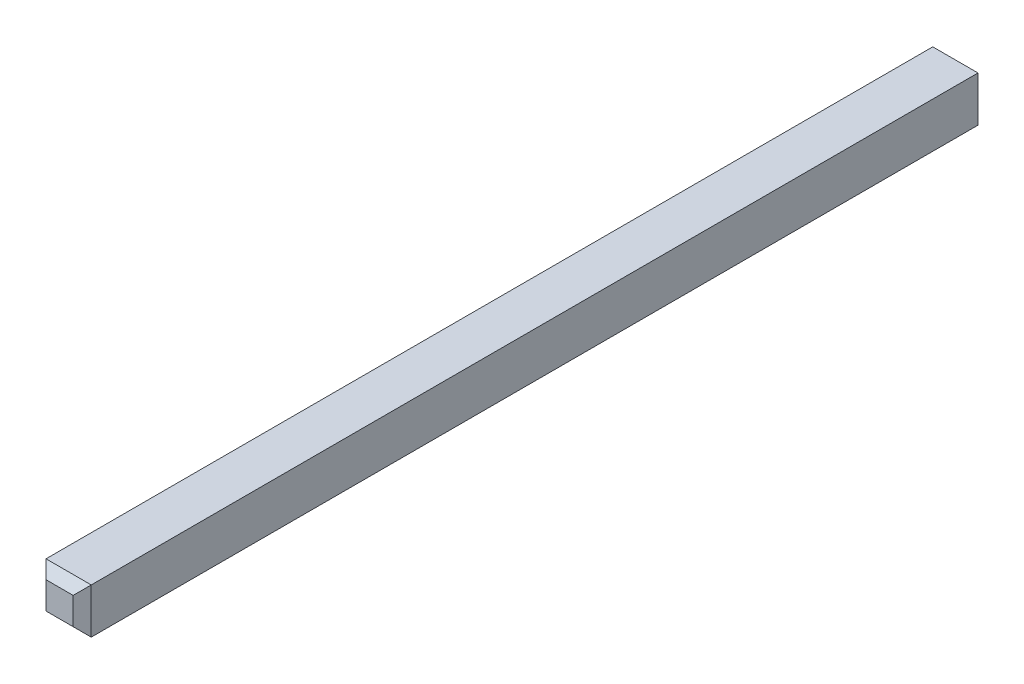
ISO-10303-21;
HEADER;
FILE_DESCRIPTION(('STEP AP214'),'2;1');
FILE_NAME('part.step','',(''),(''),'','','');
FILE_SCHEMA(('AUTOMOTIVE_DESIGN { 1 0 10303 214 1 1 1 1 }'));
ENDSEC;
DATA;
#1=APPLICATION_CONTEXT('core data for automotive mechanical design processes');
#2=APPLICATION_PROTOCOL_DEFINITION('international standard','automotive_design',2000,#1);
#3=PRODUCT_CONTEXT('',#1,'mechanical');
#4=PRODUCT('Part','Part','',(#3));
#5=PRODUCT_RELATED_PRODUCT_CATEGORY('part','',(#4));
#6=PRODUCT_DEFINITION_FORMATION('','',#4);
#7=PRODUCT_DEFINITION_CONTEXT('part definition',#1,'design');
#8=PRODUCT_DEFINITION('design','',#6,#7);
#9=PRODUCT_DEFINITION_SHAPE('','',#8);
#10=(LENGTH_UNIT() NAMED_UNIT(*) SI_UNIT(.MILLI.,.METRE.));
#11=(NAMED_UNIT(*) PLANE_ANGLE_UNIT() SI_UNIT($,.RADIAN.));
#12=(NAMED_UNIT(*) SI_UNIT($,.STERADIAN.) SOLID_ANGLE_UNIT());
#13=UNCERTAINTY_MEASURE_WITH_UNIT(LENGTH_MEASURE(1.E-05),#10,'distance_accuracy_value','');
#14=(GEOMETRIC_REPRESENTATION_CONTEXT(3) GLOBAL_UNCERTAINTY_ASSIGNED_CONTEXT((#13)) GLOBAL_UNIT_ASSIGNED_CONTEXT((#10,
#11,#12)) REPRESENTATION_CONTEXT('',''));
#15=CARTESIAN_POINT('',(0.,0.,0.));
#16=DIRECTION('',(0.,0.,1.));
#17=DIRECTION('',(1.,0.,0.));
#18=AXIS2_PLACEMENT_3D('',#15,#16,#17);
#19=CARTESIAN_POINT('',(0.249999999999999,0.25,10.));
#20=DIRECTION('',(-1.,0.,0.));
#21=DIRECTION('',(0.,-1.,0.));
#22=AXIS2_PLACEMENT_3D('',#19,#20,#21);
#23=PLANE('',#22);
#24=DIRECTION('',(0.,0.,-1.));
#25=VECTOR('',#24,1.);
#26=CARTESIAN_POINT('',(0.249999999999999,0.25,10.));
#27=LINE('',#26,#25);
#28=CARTESIAN_POINT('',(0.249999999999999,0.25,9.9));
#29=VERTEX_POINT('',#28);
#30=CARTESIAN_POINT('',(0.249999999999999,0.25,0.100000000000001));
#31=VERTEX_POINT('',#30);
#32=EDGE_CURVE('E119',#29,#31,#27,.T.);
#33=ORIENTED_EDGE('',*,*,#32,.F.);
#34=DIRECTION('',(0.,-1.,0.));
#35=VECTOR('',#34,1.);
#36=CARTESIAN_POINT('',(0.249999999999999,-0.25,9.9));
#37=LINE('',#36,#35);
#38=CARTESIAN_POINT('',(0.249999999999999,-0.25,9.9));
#39=VERTEX_POINT('',#38);
#40=EDGE_CURVE('E143',#29,#39,#37,.T.);
#41=ORIENTED_EDGE('',*,*,#40,.T.);
#42=DIRECTION('',(0.,0.,-1.));
#43=VECTOR('',#42,1.);
#44=CARTESIAN_POINT('',(0.249999999999999,-0.25,10.));
#45=LINE('',#44,#43);
#46=CARTESIAN_POINT('',(0.249999999999999,-0.25,0.100000000000001));
#47=VERTEX_POINT('',#46);
#48=EDGE_CURVE('E154',#39,#47,#45,.T.);
#49=ORIENTED_EDGE('',*,*,#48,.T.);
#50=DIRECTION('',(0.,1.,0.));
#51=VECTOR('',#50,1.);
#52=CARTESIAN_POINT('',(0.249999999999999,0.25,0.100000000000001));
#53=LINE('',#52,#51);
#54=EDGE_CURVE('E141',#47,#31,#53,.T.);
#55=ORIENTED_EDGE('',*,*,#54,.T.);
#56=EDGE_LOOP('',(#33,#41,#49,#55));
#57=FACE_BOUND('',#56,.T.);
#58=ADVANCED_FACE('F34',(#57),#23,.F.);
#59=CARTESIAN_POINT('',(-0.250000000000001,0.25,10.));
#60=DIRECTION('',(0.,-1.,0.));
#61=DIRECTION('',(0.,0.,-1.));
#62=AXIS2_PLACEMENT_3D('',#59,#60,#61);
#63=PLANE('',#62);
#64=DIRECTION('',(0.,0.,-1.));
#65=VECTOR('',#64,1.);
#66=CARTESIAN_POINT('',(-0.250000000000001,0.25,10.));
#67=LINE('',#66,#65);
#68=CARTESIAN_POINT('',(-0.250000000000001,0.25,9.9));
#69=VERTEX_POINT('',#68);
#70=CARTESIAN_POINT('',(-0.250000000000001,0.25,0.100000000000001));
#71=VERTEX_POINT('',#70);
#72=EDGE_CURVE('E281',#69,#71,#67,.T.);
#73=ORIENTED_EDGE('',*,*,#72,.F.);
#74=DIRECTION('',(1.,0.,0.));
#75=VECTOR('',#74,1.);
#76=CARTESIAN_POINT('',(0.249999999999999,0.25,9.9));
#77=LINE('',#76,#75);
#78=EDGE_CURVE('E139',#69,#29,#77,.T.);
#79=ORIENTED_EDGE('',*,*,#78,.T.);
#80=ORIENTED_EDGE('',*,*,#32,.T.);
#81=DIRECTION('',(-1.,0.,0.));
#82=VECTOR('',#81,1.);
#83=CARTESIAN_POINT('',(-0.250000000000001,0.25,0.100000000000001));
#84=LINE('',#83,#82);
#85=EDGE_CURVE('E136',#31,#71,#84,.T.);
#86=ORIENTED_EDGE('',*,*,#85,.T.);
#87=EDGE_LOOP('',(#73,#79,#80,#86));
#88=FACE_BOUND('',#87,.T.);
#89=ADVANCED_FACE('F191',(#88),#63,.F.);
#90=CARTESIAN_POINT('',(-0.250000000000001,0.25,10.));
#91=DIRECTION('',(1.,0.,0.));
#92=DIRECTION('',(0.,1.,0.));
#93=AXIS2_PLACEMENT_3D('',#90,#91,#92);
#94=PLANE('',#93);
#95=DIRECTION('',(0.,0.,-1.));
#96=VECTOR('',#95,1.);
#97=CARTESIAN_POINT('',(-0.250000000000001,-0.25,10.));
#98=LINE('',#97,#96);
#99=CARTESIAN_POINT('',(-0.250000000000001,-0.25,9.9));
#100=VERTEX_POINT('',#99);
#101=CARTESIAN_POINT('',(-0.250000000000001,-0.25,0.100000000000001));
#102=VERTEX_POINT('',#101);
#103=EDGE_CURVE('E277',#100,#102,#98,.T.);
#104=ORIENTED_EDGE('',*,*,#103,.F.);
#105=DIRECTION('',(0.,1.,0.));
#106=VECTOR('',#105,1.);
#107=CARTESIAN_POINT('',(-0.250000000000001,0.25,9.9));
#108=LINE('',#107,#106);
#109=EDGE_CURVE('E134',#100,#69,#108,.T.);
#110=ORIENTED_EDGE('',*,*,#109,.T.);
#111=ORIENTED_EDGE('',*,*,#72,.T.);
#112=DIRECTION('',(0.,-1.,0.));
#113=VECTOR('',#112,1.);
#114=CARTESIAN_POINT('',(-0.250000000000001,0.25,0.100000000000001));
#115=LINE('',#114,#113);
#116=EDGE_CURVE('E132',#71,#102,#115,.T.);
#117=ORIENTED_EDGE('',*,*,#116,.T.);
#118=EDGE_LOOP('',(#104,#110,#111,#117));
#119=FACE_BOUND('',#118,.T.);
#120=ADVANCED_FACE('F197',(#119),#94,.F.);
#121=CARTESIAN_POINT('',(-0.250000000000001,-0.25,10.));
#122=DIRECTION('',(0.,1.,0.));
#123=DIRECTION('',(0.,0.,1.));
#124=AXIS2_PLACEMENT_3D('',#121,#122,#123);
#125=PLANE('',#124);
#126=ORIENTED_EDGE('',*,*,#48,.F.);
#127=DIRECTION('',(-1.,0.,0.));
#128=VECTOR('',#127,1.);
#129=CARTESIAN_POINT('',(-0.250000000000001,-0.25,9.9));
#130=LINE('',#129,#128);
#131=EDGE_CURVE('E106',#39,#100,#130,.T.);
#132=ORIENTED_EDGE('',*,*,#131,.T.);
#133=ORIENTED_EDGE('',*,*,#103,.T.);
#134=DIRECTION('',(1.,0.,0.));
#135=VECTOR('',#134,1.);
#136=CARTESIAN_POINT('',(-0.250000000000001,-0.25,0.100000000000001));
#137=LINE('',#136,#135);
#138=EDGE_CURVE('E125',#102,#47,#137,.T.);
#139=ORIENTED_EDGE('',*,*,#138,.T.);
#140=EDGE_LOOP('',(#126,#132,#133,#139));
#141=FACE_BOUND('',#140,.T.);
#142=ADVANCED_FACE('F187',(#141),#125,.F.);
#143=CARTESIAN_POINT('',(0.,0.,10.));
#144=DIRECTION('',(0.,0.,1.));
#145=DIRECTION('',(1.,0.,0.));
#146=AXIS2_PLACEMENT_3D('',#143,#144,#145);
#147=PLANE('',#146);
#148=DIRECTION('',(0.,-1.,0.));
#149=VECTOR('',#148,1.);
#150=CARTESIAN_POINT('',(-0.150000000000003,-0.25,10.));
#151=LINE('',#150,#149);
#152=CARTESIAN_POINT('',(-0.150000000000003,0.150000000000002,10.));
#153=VERTEX_POINT('',#152);
#154=CARTESIAN_POINT('',(-0.150000000000003,-0.150000000000002,10.));
#155=VERTEX_POINT('',#154);
#156=EDGE_CURVE('E123',#153,#155,#151,.T.);
#157=ORIENTED_EDGE('',*,*,#156,.T.);
#158=DIRECTION('',(1.,0.,0.));
#159=VECTOR('',#158,1.);
#160=CARTESIAN_POINT('',(0.249999999999999,-0.150000000000002,10.));
#161=LINE('',#160,#159);
#162=CARTESIAN_POINT('',(0.15,-0.150000000000002,10.));
#163=VERTEX_POINT('',#162);
#164=EDGE_CURVE('E104',#155,#163,#161,.T.);
#165=ORIENTED_EDGE('',*,*,#164,.T.);
#166=DIRECTION('',(0.,1.,0.));
#167=VECTOR('',#166,1.);
#168=CARTESIAN_POINT('',(0.15,0.25,10.));
#169=LINE('',#168,#167);
#170=CARTESIAN_POINT('',(0.15,0.150000000000002,10.));
#171=VERTEX_POINT('',#170);
#172=EDGE_CURVE('E112',#163,#171,#169,.T.);
#173=ORIENTED_EDGE('',*,*,#172,.T.);
#174=DIRECTION('',(-1.,0.,0.));
#175=VECTOR('',#174,1.);
#176=CARTESIAN_POINT('',(-0.250000000000001,0.150000000000002,10.));
#177=LINE('',#176,#175);
#178=EDGE_CURVE('E118',#171,#153,#177,.T.);
#179=ORIENTED_EDGE('',*,*,#178,.T.);
#180=EDGE_LOOP('',(#157,#165,#173,#179));
#181=FACE_BOUND('',#180,.T.);
#182=ADVANCED_FACE('F121',(#181),#147,.T.);
#183=CARTESIAN_POINT('',(0.,0.,0.));
#184=DIRECTION('',(0.,0.,1.));
#185=DIRECTION('',(1.,0.,0.));
#186=AXIS2_PLACEMENT_3D('',#183,#184,#185);
#187=PLANE('',#186);
#188=DIRECTION('',(0.,1.,0.));
#189=VECTOR('',#188,1.);
#190=CARTESIAN_POINT('',(-0.15,0.,0.));
#191=LINE('',#190,#189);
#192=CARTESIAN_POINT('',(-0.15,-0.149999999999999,0.));
#193=VERTEX_POINT('',#192);
#194=CARTESIAN_POINT('',(-0.15,0.149999999999999,0.));
#195=VERTEX_POINT('',#194);
#196=EDGE_CURVE('E43',#193,#195,#191,.T.);
#197=ORIENTED_EDGE('',*,*,#196,.T.);
#198=DIRECTION('',(1.,0.,0.));
#199=VECTOR('',#198,1.);
#200=CARTESIAN_POINT('',(0.,0.149999999999999,0.));
#201=LINE('',#200,#199);
#202=CARTESIAN_POINT('',(0.149999999999998,0.149999999999999,0.));
#203=VERTEX_POINT('',#202);
#204=EDGE_CURVE('E11',#195,#203,#201,.T.);
#205=ORIENTED_EDGE('',*,*,#204,.T.);
#206=DIRECTION('',(0.,-1.,0.));
#207=VECTOR('',#206,1.);
#208=CARTESIAN_POINT('',(0.149999999999998,0.,0.));
#209=LINE('',#208,#207);
#210=CARTESIAN_POINT('',(0.149999999999998,-0.149999999999999,0.));
#211=VERTEX_POINT('',#210);
#212=EDGE_CURVE('E145',#203,#211,#209,.T.);
#213=ORIENTED_EDGE('',*,*,#212,.T.);
#214=DIRECTION('',(-1.,0.,0.));
#215=VECTOR('',#214,1.);
#216=CARTESIAN_POINT('',(0.,-0.149999999999999,0.));
#217=LINE('',#216,#215);
#218=EDGE_CURVE('E54',#211,#193,#217,.T.);
#219=ORIENTED_EDGE('',*,*,#218,.T.);
#220=EDGE_LOOP('',(#197,#205,#213,#219));
#221=FACE_BOUND('',#220,.T.);
#222=ADVANCED_FACE('F176',(#221),#187,.F.);
#223=CARTESIAN_POINT('',(0.,0.150000000000002,10.));
#224=DIRECTION('',(0.,0.707106781186551,0.707106781186544));
#225=DIRECTION('',(1.,0.,0.));
#226=AXIS2_PLACEMENT_3D('',#223,#224,#225);
#227=PLANE('',#226);
#228=DIRECTION('',(-0.577350269189624,-0.577350269189624,0.577350269189629));
#229=VECTOR('',#228,1.);
#230=CARTESIAN_POINT('',(0.1,0.100000000000001,10.05));
#231=LINE('',#230,#229);
#232=EDGE_CURVE('E115',#29,#171,#231,.T.);
#233=ORIENTED_EDGE('',*,*,#232,.F.);
#234=ORIENTED_EDGE('',*,*,#78,.F.);
#235=DIRECTION('',(0.577350269189624,-0.577350269189624,0.577350269189629));
#236=VECTOR('',#235,1.);
#237=CARTESIAN_POINT('',(-0.100000000000002,0.100000000000001,10.05));
#238=LINE('',#237,#236);
#239=EDGE_CURVE('E151',#153,#69,#238,.F.);
#240=ORIENTED_EDGE('',*,*,#239,.F.);
#241=ORIENTED_EDGE('',*,*,#178,.F.);
#242=EDGE_LOOP('',(#233,#234,#240,#241));
#243=FACE_BOUND('',#242,.T.);
#244=ADVANCED_FACE('F178',(#243),#227,.T.);
#245=CARTESIAN_POINT('',(-0.150000000000003,0.,10.));
#246=DIRECTION('',(-0.707106781186551,0.,0.707106781186544));
#247=DIRECTION('',(0.,1.,0.));
#248=AXIS2_PLACEMENT_3D('',#245,#246,#247);
#249=PLANE('',#248);
#250=ORIENTED_EDGE('',*,*,#239,.T.);
#251=ORIENTED_EDGE('',*,*,#109,.F.);
#252=DIRECTION('',(0.577350269189624,0.577350269189624,0.577350269189629));
#253=VECTOR('',#252,1.);
#254=CARTESIAN_POINT('',(-0.100000000000003,-0.100000000000001,10.05));
#255=LINE('',#254,#253);
#256=EDGE_CURVE('E109',#155,#100,#255,.F.);
#257=ORIENTED_EDGE('',*,*,#256,.F.);
#258=ORIENTED_EDGE('',*,*,#156,.F.);
#259=EDGE_LOOP('',(#250,#251,#257,#258));
#260=FACE_BOUND('',#259,.T.);
#261=ADVANCED_FACE('F184',(#260),#249,.T.);
#262=CARTESIAN_POINT('',(0.15,0.,10.));
#263=DIRECTION('',(0.707106781186551,0.,0.707106781186544));
#264=DIRECTION('',(0.,-1.,0.));
#265=AXIS2_PLACEMENT_3D('',#262,#263,#264);
#266=PLANE('',#265);
#267=ORIENTED_EDGE('',*,*,#232,.T.);
#268=ORIENTED_EDGE('',*,*,#172,.F.);
#269=DIRECTION('',(0.577350269189624,-0.577350269189624,-0.577350269189629));
#270=VECTOR('',#269,1.);
#271=CARTESIAN_POINT('',(0.1,-0.100000000000001,10.05));
#272=LINE('',#271,#270);
#273=EDGE_CURVE('E100',#39,#163,#272,.F.);
#274=ORIENTED_EDGE('',*,*,#273,.F.);
#275=ORIENTED_EDGE('',*,*,#40,.F.);
#276=EDGE_LOOP('',(#267,#268,#274,#275));
#277=FACE_BOUND('',#276,.T.);
#278=ADVANCED_FACE('F113',(#277),#266,.T.);
#279=CARTESIAN_POINT('',(0.,-0.150000000000002,10.));
#280=DIRECTION('',(0.,-0.707106781186551,0.707106781186544));
#281=DIRECTION('',(-1.,0.,0.));
#282=AXIS2_PLACEMENT_3D('',#279,#280,#281);
#283=PLANE('',#282);
#284=ORIENTED_EDGE('',*,*,#256,.T.);
#285=ORIENTED_EDGE('',*,*,#131,.F.);
#286=ORIENTED_EDGE('',*,*,#273,.T.);
#287=ORIENTED_EDGE('',*,*,#164,.F.);
#288=EDGE_LOOP('',(#284,#285,#286,#287));
#289=FACE_BOUND('',#288,.T.);
#290=ADVANCED_FACE('F102',(#289),#283,.T.);
#291=CARTESIAN_POINT('',(-0.250000000000001,-0.25,0.100000000000001));
#292=DIRECTION('',(0.,0.707106781186547,0.707106781186547));
#293=DIRECTION('',(1.,0.,0.));
#294=AXIS2_PLACEMENT_3D('',#291,#292,#293);
#295=PLANE('',#294);
#296=DIRECTION('',(0.577350269189626,0.577350269189626,-0.577350269189626));
#297=VECTOR('',#296,1.);
#298=CARTESIAN_POINT('',(-0.250000000000001,-0.25,0.100000000000001));
#299=LINE('',#298,#297);
#300=EDGE_CURVE('E158',#193,#102,#299,.F.);
#301=ORIENTED_EDGE('',*,*,#300,.F.);
#302=ORIENTED_EDGE('',*,*,#218,.F.);
#303=DIRECTION('',(-0.577350269189626,0.577350269189626,-0.577350269189626));
#304=VECTOR('',#303,1.);
#305=CARTESIAN_POINT('',(0.0833333333333322,-0.0833333333333334,-0.0666666666666656));
#306=LINE('',#305,#304);
#307=EDGE_CURVE('E38',#47,#211,#306,.T.);
#308=ORIENTED_EDGE('',*,*,#307,.F.);
#309=ORIENTED_EDGE('',*,*,#138,.F.);
#310=EDGE_LOOP('',(#301,#302,#308,#309));
#311=FACE_BOUND('',#310,.T.);
#312=ADVANCED_FACE('F36',(#311),#295,.F.);
#313=CARTESIAN_POINT('',(0.249999999999999,0.25,0.100000000000001));
#314=DIRECTION('',(-0.707106781186547,0.,0.707106781186547));
#315=DIRECTION('',(0.,1.,0.));
#316=AXIS2_PLACEMENT_3D('',#313,#314,#315);
#317=PLANE('',#316);
#318=ORIENTED_EDGE('',*,*,#307,.T.);
#319=ORIENTED_EDGE('',*,*,#212,.F.);
#320=DIRECTION('',(0.577350269189626,0.577350269189626,0.577350269189626));
#321=VECTOR('',#320,1.);
#322=CARTESIAN_POINT('',(0.249999999999999,0.25,0.100000000000001));
#323=LINE('',#322,#321);
#324=EDGE_CURVE('E157',#31,#203,#323,.F.);
#325=ORIENTED_EDGE('',*,*,#324,.F.);
#326=ORIENTED_EDGE('',*,*,#54,.F.);
#327=EDGE_LOOP('',(#318,#319,#325,#326));
#328=FACE_BOUND('',#327,.T.);
#329=ADVANCED_FACE('F167',(#328),#317,.F.);
#330=CARTESIAN_POINT('',(-0.250000000000001,0.25,0.100000000000001));
#331=DIRECTION('',(0.707106781186547,0.,0.707106781186547));
#332=DIRECTION('',(0.,-1.,0.));
#333=AXIS2_PLACEMENT_3D('',#330,#331,#332);
#334=PLANE('',#333);
#335=ORIENTED_EDGE('',*,*,#300,.T.);
#336=ORIENTED_EDGE('',*,*,#116,.F.);
#337=DIRECTION('',(0.577350269189626,-0.577350269189626,-0.577350269189626));
#338=VECTOR('',#337,1.);
#339=CARTESIAN_POINT('',(-0.250000000000001,0.25,0.100000000000001));
#340=LINE('',#339,#338);
#341=EDGE_CURVE('E155',#195,#71,#340,.F.);
#342=ORIENTED_EDGE('',*,*,#341,.F.);
#343=ORIENTED_EDGE('',*,*,#196,.F.);
#344=EDGE_LOOP('',(#335,#336,#342,#343));
#345=FACE_BOUND('',#344,.T.);
#346=ADVANCED_FACE('F172',(#345),#334,.F.);
#347=CARTESIAN_POINT('',(-0.250000000000001,0.25,0.100000000000001));
#348=DIRECTION('',(0.,-0.707106781186547,0.707106781186547));
#349=DIRECTION('',(-1.,0.,0.));
#350=AXIS2_PLACEMENT_3D('',#347,#348,#349);
#351=PLANE('',#350);
#352=ORIENTED_EDGE('',*,*,#324,.T.);
#353=ORIENTED_EDGE('',*,*,#204,.F.);
#354=ORIENTED_EDGE('',*,*,#341,.T.);
#355=ORIENTED_EDGE('',*,*,#85,.F.);
#356=EDGE_LOOP('',(#352,#353,#354,#355));
#357=FACE_BOUND('',#356,.T.);
#358=ADVANCED_FACE('F175',(#357),#351,.F.);
#359=CLOSED_SHELL('',(#58,#89,#120,#142,#182,#222,#244,#261,#278,#290,#312,#329,#346,#358));
#360=MANIFOLD_SOLID_BREP('B2',#359);
#361=ADVANCED_BREP_SHAPE_REPRESENTATION('',(#18,#360),#14);
#362=SHAPE_DEFINITION_REPRESENTATION(#9,#361);
ENDSEC;
END-ISO-10303-21;
